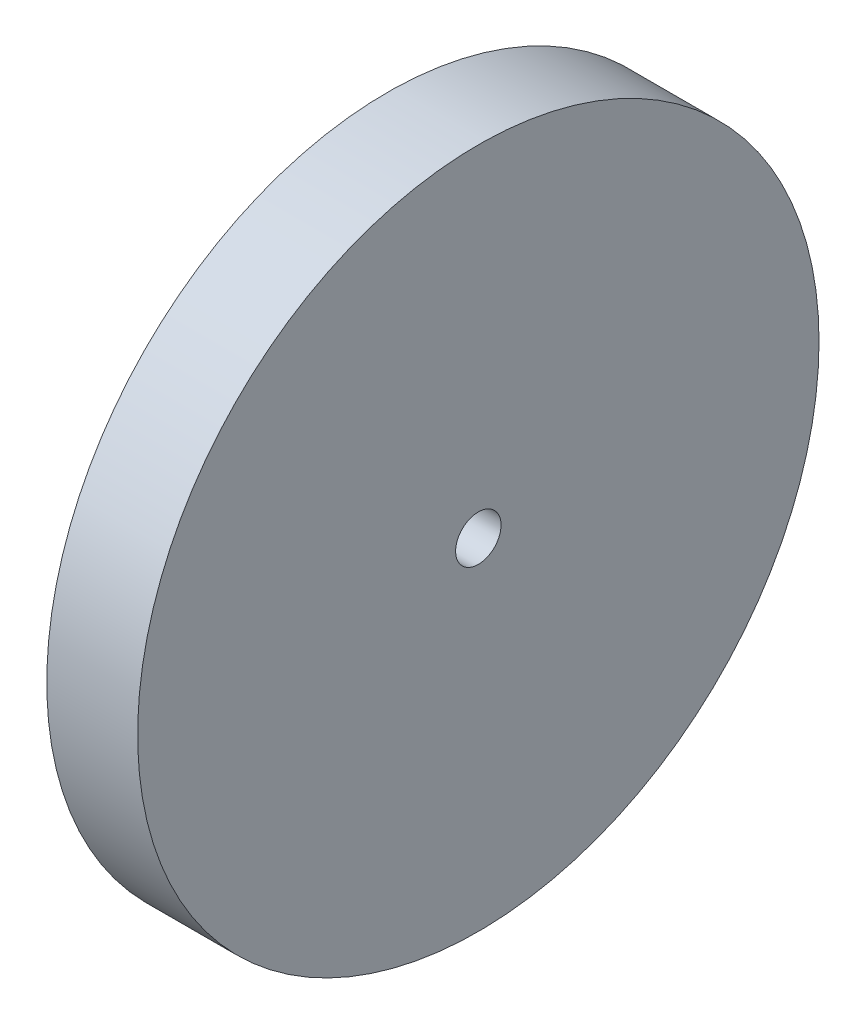
ISO-10303-21;
HEADER;
FILE_DESCRIPTION(('STEP AP214'),'2;1');
FILE_NAME('part.step','',(''),(''),'','','');
FILE_SCHEMA(('AUTOMOTIVE_DESIGN { 1 0 10303 214 1 1 1 1 }'));
ENDSEC;
DATA;
#1=APPLICATION_CONTEXT('core data for automotive mechanical design processes');
#2=APPLICATION_PROTOCOL_DEFINITION('international standard','automotive_design',2000,#1);
#3=PRODUCT_CONTEXT('',#1,'mechanical');
#4=PRODUCT('Part','Part','',(#3));
#5=PRODUCT_RELATED_PRODUCT_CATEGORY('part','',(#4));
#6=PRODUCT_DEFINITION_FORMATION('','',#4);
#7=PRODUCT_DEFINITION_CONTEXT('part definition',#1,'design');
#8=PRODUCT_DEFINITION('design','',#6,#7);
#9=PRODUCT_DEFINITION_SHAPE('','',#8);
#10=(LENGTH_UNIT() NAMED_UNIT(*) SI_UNIT(.MILLI.,.METRE.));
#11=(NAMED_UNIT(*) PLANE_ANGLE_UNIT() SI_UNIT($,.RADIAN.));
#12=(NAMED_UNIT(*) SI_UNIT($,.STERADIAN.) SOLID_ANGLE_UNIT());
#13=UNCERTAINTY_MEASURE_WITH_UNIT(LENGTH_MEASURE(1.E-05),#10,'distance_accuracy_value','');
#14=(GEOMETRIC_REPRESENTATION_CONTEXT(3) GLOBAL_UNCERTAINTY_ASSIGNED_CONTEXT((#13)) GLOBAL_UNIT_ASSIGNED_CONTEXT((#10,
#11,#12)) REPRESENTATION_CONTEXT('',''));
#15=CARTESIAN_POINT('',(0.,0.,0.));
#16=DIRECTION('',(0.,0.,1.));
#17=DIRECTION('',(1.,0.,0.));
#18=AXIS2_PLACEMENT_3D('',#15,#16,#17);
#19=CARTESIAN_POINT('',(0.,0.,0.));
#20=DIRECTION('',(1.,0.,0.));
#21=DIRECTION('',(0.,0.,-1.));
#22=AXIS2_PLACEMENT_3D('',#19,#20,#21);
#23=CYLINDRICAL_SURFACE('',#22,1.99999999999999);
#24=CARTESIAN_POINT('',(-13.45322017837,1.79843682124226,0.874999999999999));
#25=CARTESIAN_POINT('',(-13.4996455668491,1.79844267025872,0.874994185373086));
#26=CARTESIAN_POINT('',(-13.5461362263386,1.80026089575614,0.871281814553723));
#27=CARTESIAN_POINT('',(-13.6377609995906,1.80729814585877,0.856583265673776));
#28=CARTESIAN_POINT('',(-13.6828912938866,1.81252595391355,0.84557829993033));
#29=CARTESIAN_POINT('',(-13.7702976402033,1.8256650779135,0.816819377461344));
#30=CARTESIAN_POINT('',(-13.8125852056156,1.8335646755163,0.799094852047655));
#31=CARTESIAN_POINT('',(-13.8935757385446,1.85114060751144,0.757486974078159));
#32=CARTESIAN_POINT('',(-13.9322792980636,1.86081664768249,0.73360464113771));
#33=CARTESIAN_POINT('',(-14.0076858180357,1.88159814273405,0.67860444231314));
#34=CARTESIAN_POINT('',(-14.0441131990626,1.89275511820233,0.647128046535023));
#35=CARTESIAN_POINT('',(-14.1113783929879,1.91482009276172,0.578584404393027));
#36=CARTESIAN_POINT('',(-14.142213918134,1.92572798836067,0.54151488106822));
#37=CARTESIAN_POINT('',(-14.1988776130539,1.94670307260467,0.460623507148396));
#38=CARTESIAN_POINT('',(-14.2243889001395,1.95670347428988,0.41656077793032));
#39=CARTESIAN_POINT('',(-14.2675157518473,1.97409759337225,0.324251594935387));
#40=CARTESIAN_POINT('',(-14.2851351629206,1.98149258025648,0.276007192994719));
#41=CARTESIAN_POINT('',(-14.3109580815994,1.99247601660861,0.179604041111906));
#42=CARTESIAN_POINT('',(-14.319638658996,1.99625645567351,0.131595413599112));
#43=CARTESIAN_POINT('',(-14.3288859892659,2.00028676065695,0.0346643937267909));
#44=CARTESIAN_POINT('',(-14.3294563937463,2.00053821550072,-0.0142575774637081));
#45=CARTESIAN_POINT('',(-14.3227019762157,1.99759023252614,-0.108130873463996));
#46=CARTESIAN_POINT('',(-14.3159033487893,1.99462077737978,-0.153128695211823));
#47=CARTESIAN_POINT('',(-14.295515053418,1.98588800112158,-0.241269408956307));
#48=CARTESIAN_POINT('',(-14.2819248829422,1.98012447326713,-0.284412163433232));
#49=CARTESIAN_POINT('',(-14.2481883972403,1.96624268291741,-0.368417631333126));
#50=CARTESIAN_POINT('',(-14.2279450345039,1.95808977061224,-0.409235407844303));
#51=CARTESIAN_POINT('',(-14.1815782919894,1.94021222057016,-0.487002053634942));
#52=CARTESIAN_POINT('',(-14.1554527802275,1.93048701331643,-0.523949512986161));
#53=CARTESIAN_POINT('',(-14.095743534564,1.90954741359336,-0.595935871549107));
#54=CARTESIAN_POINT('',(-14.0617419102102,1.89827601276047,-0.630612038356138));
#55=CARTESIAN_POINT('',(-13.9884073903243,1.87605441136165,-0.693936886024361));
#56=CARTESIAN_POINT('',(-13.9490720130834,1.86510436321814,-0.722582745149668));
#57=CARTESIAN_POINT('',(-13.8642488780768,1.84433360774734,-0.774104007572307));
#58=CARTESIAN_POINT('',(-13.8185799874721,1.83457425910816,-0.796708133338992));
#59=CARTESIAN_POINT('',(-13.7235451295974,1.81804057215013,-0.833753424928245));
#60=CARTESIAN_POINT('',(-13.6741821543204,1.81126384804948,-0.848201117652945));
#61=CARTESIAN_POINT('',(-13.5768048279816,1.8020725724064,-0.86754954409033));
#62=CARTESIAN_POINT('',(-13.5289342267471,1.79938817756936,-0.873042695282303));
#63=CARTESIAN_POINT('',(-13.4328901766476,1.79791183626622,-0.876080687797387));
#64=CARTESIAN_POINT('',(-13.3847168599139,1.79911829529383,-0.873628785071821));
#65=CARTESIAN_POINT('',(-13.2931886211794,1.80500670942424,-0.861388170364229));
#66=CARTESIAN_POINT('',(-13.249740356961,1.80942578993547,-0.85215387305427));
#67=CARTESIAN_POINT('',(-13.1650554737938,1.82089297578771,-0.827365600067959));
#68=CARTESIAN_POINT('',(-13.1238194113395,1.82794173912936,-0.81181004259548));
#69=CARTESIAN_POINT('',(-13.0426847429497,1.84425139082008,-0.774064553531829));
#70=CARTESIAN_POINT('',(-13.0029259532811,1.85359632906455,-0.751611624558049));
#71=CARTESIAN_POINT('',(-12.9275374391374,1.87333686493426,-0.700961597965227));
#72=CARTESIAN_POINT('',(-12.8919096333482,1.88373294661273,-0.67276184779974));
#73=CARTESIAN_POINT('',(-12.8223972844785,1.9055511022817,-0.608384071274641));
#74=CARTESIAN_POINT('',(-12.7889703773977,1.91698003267099,-0.571712181701362));
#75=CARTESIAN_POINT('',(-12.7286480364516,1.93870750509733,-0.493028918701698));
#76=CARTESIAN_POINT('',(-12.7017534029818,1.94900590852694,-0.451016891911296));
#77=CARTESIAN_POINT('',(-12.6551778658299,1.96743104077039,-0.36232293883673));
#78=CARTESIAN_POINT('',(-12.6355478993033,1.97554233072842,-0.315610854101785));
#79=CARTESIAN_POINT('',(-12.6045830029,1.98855746644758,-0.219097297225345));
#80=CARTESIAN_POINT('',(-12.5932425737112,1.99346343839954,-0.169297897056046));
#81=CARTESIAN_POINT('',(-12.5799216972897,1.9992481211277,-0.07209118045084));
#82=CARTESIAN_POINT('',(-12.5772979505768,2.00040346809815,-0.0247879798759334));
#83=CARTESIAN_POINT('',(-12.5797156890887,1.99934575386789,0.0695781809476551));
#84=CARTESIAN_POINT('',(-12.5847555731484,1.99713339628286,0.116641189318635));
#85=CARTESIAN_POINT('',(-12.6018970800604,1.98974125718853,0.207139588656076));
#86=CARTESIAN_POINT('',(-12.6136929883777,1.98469010746016,0.250644310304771));
#87=CARTESIAN_POINT('',(-12.6436605807471,1.97220099963069,0.335028608079217));
#88=CARTESIAN_POINT('',(-12.66183340789,1.96476261362741,0.375907711996158));
#89=CARTESIAN_POINT('',(-12.7049588556092,1.94778329676525,0.455950413510898));
#90=CARTESIAN_POINT('',(-12.7301838494413,1.93816167830775,0.494949713940653));
#91=CARTESIAN_POINT('',(-12.7863173209961,1.9179284324557,0.568332496894421));
#92=CARTESIAN_POINT('',(-12.8172281396271,1.90731639818727,0.602714068131048));
#93=CARTESIAN_POINT('',(-12.8866180691496,1.8852720278619,0.668615771310957));
#94=CARTESIAN_POINT('',(-12.92549407957,1.87383871323809,0.699719139890721));
#95=CARTESIAN_POINT('',(-13.008235966694,1.85224037393765,0.755043607534097));
#96=CARTESIAN_POINT('',(-13.0521048360146,1.84207611764286,0.779260548271213));
#97=CARTESIAN_POINT('',(-13.1438407753336,1.82429849284974,0.820019671710732));
#98=CARTESIAN_POINT('',(-13.1917127591117,1.81668831862308,0.836552253811327));
#99=CARTESIAN_POINT('',(-13.2899205481475,1.80518424635639,0.861104681242927));
#100=CARTESIAN_POINT('',(-13.3402474868291,1.80127788482797,0.869153086488734));
#101=CARTESIAN_POINT('',(-13.4116225729651,1.79879556732175,0.874260805643789));
#102=CARTESIAN_POINT('',(-13.4324148213181,1.79843420002831,0.875002605802406));
#103=CARTESIAN_POINT('',(-13.45322017837,1.79843682124226,0.874999999999999));
#104=B_SPLINE_CURVE_WITH_KNOTS('',3,(#24,#25,#26,#27,#28,#29,#30,#31,#32,#33,#34,#35,#36,#37,
#38,#39,#40,#41,#42,#43,#44,#45,#46,#47,#48,#49,#50,#51,#52,#53,#54,#55,#56,#57,#58,#59,#60,#61,
#62,#63,#64,#65,#66,#67,#68,#69,#70,#71,#72,#73,#74,#75,#76,#77,#78,#79,#80,#81,#82,#83,#84,#85,
#86,#87,#88,#89,#90,#91,#92,#93,#94,#95,#96,#97,#98,#99,#100,#101,#102,#103),.UNSPECIFIED.,.T.,
.F.,(4,2,2,2,2,2,2,2,2,2,2,2,2,2,2,2,2,2,2,2,2,2,2,2,2,2,2,2,2,2,2,2,2,2,2,2,2,2,2,4),(0.,
0.139211854544829,0.278783757833573,0.417751277057172,0.556695800673241,0.704311269509711,
0.851986995525496,1.00685254156655,1.16164252475057,1.30765941027075,1.45361054957448,
1.58978716337857,1.72597385487562,1.86424242444373,2.00256119034027,2.1514705177321,
2.30044936949917,2.45528783220658,2.61000221454627,2.75399082716966,2.89792043948698,
3.03123544972419,3.16458384051276,3.30382998316913,3.44314054349794,3.5951953656407,
3.74726880958002,3.90038919363012,4.0534079045894,4.19484840308351,4.33625935442152,
4.47172667892147,4.60721829895103,4.74891487272681,4.8906699154392,5.04321071182055,
5.19584342435713,5.34866632230719,5.50097312018721,5.56336037066704),.UNSPECIFIED.);
#105=CARTESIAN_POINT('',(-13.45322017837,1.79843682124226,0.874999999999999));
#106=VERTEX_POINT('',#105);
#107=EDGE_CURVE('E64',#106,#106,#104,.T.);
#108=ORIENTED_EDGE('',*,*,#107,.F.);
#109=EDGE_LOOP('',(#108));
#110=FACE_BOUND('',#109,.T.);
#111=CARTESIAN_POINT('',(0.,0.,0.));
#112=DIRECTION('',(1.,0.,0.));
#113=DIRECTION('',(0.,0.,-1.));
#114=AXIS2_PLACEMENT_3D('',#111,#112,#113);
#115=CIRCLE('',#114,1.99999999999999);
#116=CARTESIAN_POINT('',(0.,0.,-1.99999999999999));
#117=VERTEX_POINT('',#116);
#118=EDGE_CURVE('E54',#117,#117,#115,.T.);
#119=ORIENTED_EDGE('',*,*,#118,.T.);
#120=EDGE_LOOP('',(#119));
#121=FACE_BOUND('',#120,.T.);
#122=CARTESIAN_POINT('',(-18.,0.,0.));
#123=DIRECTION('',(1.,0.,0.));
#124=DIRECTION('',(0.,0.,-1.));
#125=AXIS2_PLACEMENT_3D('',#122,#123,#124);
#126=CIRCLE('',#125,1.99999999999999);
#127=CARTESIAN_POINT('',(-18.,0.,-1.99999999999999));
#128=VERTEX_POINT('',#127);
#129=EDGE_CURVE('E10',#128,#128,#126,.T.);
#130=ORIENTED_EDGE('',*,*,#129,.F.);
#131=EDGE_LOOP('',(#130));
#132=FACE_BOUND('',#131,.T.);
#133=ADVANCED_FACE('F32',(#110,#121,#132),#23,.F.);
#134=CARTESIAN_POINT('',(-18.,5.,0.));
#135=DIRECTION('',(-1.,0.,0.));
#136=DIRECTION('',(0.,0.,1.));
#137=AXIS2_PLACEMENT_3D('',#134,#135,#136);
#138=PLANE('',#137);
#139=ORIENTED_EDGE('',*,*,#129,.T.);
#140=EDGE_LOOP('',(#139));
#141=FACE_BOUND('',#140,.T.);
#142=CARTESIAN_POINT('',(-18.,0.,0.));
#143=DIRECTION('',(1.,0.,0.));
#144=DIRECTION('',(0.,0.,-1.));
#145=AXIS2_PLACEMENT_3D('',#142,#143,#144);
#146=CIRCLE('',#145,5.);
#147=CARTESIAN_POINT('',(-18.,0.,-5.));
#148=VERTEX_POINT('',#147);
#149=EDGE_CURVE('E38',#148,#148,#146,.T.);
#150=ORIENTED_EDGE('',*,*,#149,.F.);
#151=EDGE_LOOP('',(#150));
#152=FACE_BOUND('',#151,.T.);
#153=ADVANCED_FACE('F91',(#141,#152),#138,.T.);
#154=CARTESIAN_POINT('',(0.,0.,0.));
#155=DIRECTION('',(1.,0.,0.));
#156=DIRECTION('',(0.,0.,-1.));
#157=AXIS2_PLACEMENT_3D('',#154,#155,#156);
#158=CYLINDRICAL_SURFACE('',#157,5.);
#159=CARTESIAN_POINT('',(-13.45322017837,4.9228421668788,0.874999999999999));
#160=CARTESIAN_POINT('',(-13.4044765120783,4.92284307499697,0.874998073539557));
#161=CARTESIAN_POINT('',(-13.3557071366336,4.92357397476884,0.870913147606656));
#162=CARTESIAN_POINT('',(-13.25953938974,4.92641556128211,0.854689981459766));
#163=CARTESIAN_POINT('',(-13.2121422829829,4.92852748100301,0.842544544648483));
#164=CARTESIAN_POINT('',(-13.1201246317655,4.93388475646331,0.810581240433705));
#165=CARTESIAN_POINT('',(-13.0755017036428,4.93712912285695,0.790770068454977));
#166=CARTESIAN_POINT('',(-12.990217100068,4.94438456334799,0.744054765254319));
#167=CARTESIAN_POINT('',(-12.9495550324841,4.94839556143087,0.717151337156948));
#168=CARTESIAN_POINT('',(-12.872900850826,4.95678097185183,0.656703779310403));
#169=CARTESIAN_POINT('',(-12.8369579756245,4.96115853789756,0.623097637866167));
#170=CARTESIAN_POINT('',(-12.7711906584155,4.96975589120863,0.550332633939766));
#171=CARTESIAN_POINT('',(-12.7413665937748,4.97397566872952,0.51117342923396));
#172=CARTESIAN_POINT('',(-12.6884971547799,4.98181553132084,0.428093104045913));
#173=CARTESIAN_POINT('',(-12.6654978435704,4.98543147235489,0.384142246104396));
#174=CARTESIAN_POINT('',(-12.627227119512,4.99162106697564,0.292926899802081));
#175=CARTESIAN_POINT('',(-12.6119551530828,4.99419479522293,0.245662649086159));
#176=CARTESIAN_POINT('',(-12.5897238897306,4.99798770637486,0.149671533158271));
#177=CARTESIAN_POINT('',(-12.5826817462932,4.9992203802933,0.100964396772047));
#178=CARTESIAN_POINT('',(-12.5768522109989,5.00023870350343,0.00304537017441892));
#179=CARTESIAN_POINT('',(-12.5780642031927,5.00002446076855,-0.0461664820998754));
#180=CARTESIAN_POINT('',(-12.5886443402899,4.99818371661764,-0.143130893939201));
#181=CARTESIAN_POINT('',(-12.5979233089294,4.99657265682183,-0.190893519071767));
#182=CARTESIAN_POINT('',(-12.6242333433602,4.99213654894816,-0.284173216176665));
#183=CARTESIAN_POINT('',(-12.6412646637993,4.9893114609923,-0.329690214330628));
#184=CARTESIAN_POINT('',(-12.6826831500164,4.98273861194286,-0.417449271832483));
#185=CARTESIAN_POINT('',(-12.7071066358228,4.9789863122702,-0.459673835906608));
#186=CARTESIAN_POINT('',(-12.7625894937887,4.9709751939494,-0.539458800879953));
#187=CARTESIAN_POINT('',(-12.793649456538,4.96671633023635,-0.577018786200772));
#188=CARTESIAN_POINT('',(-12.8620169805182,4.9580977872857,-0.646935876894303));
#189=CARTESIAN_POINT('',(-12.8994025162358,4.95373752143685,-0.679216709920823));
#190=CARTESIAN_POINT('',(-12.9790983816665,4.9454624226339,-0.737060264743535));
#191=CARTESIAN_POINT('',(-13.0214087663049,4.9415475946486,-0.762622911603708));
#192=CARTESIAN_POINT('',(-13.1098466262571,4.9346060965737,-0.806322044336454));
#193=CARTESIAN_POINT('',(-13.1559790999631,4.93158061381118,-0.824448615268406));
#194=CARTESIAN_POINT('',(-13.2506991598437,4.92677939981509,-0.852673278505629));
#195=CARTESIAN_POINT('',(-13.299286505656,4.92500354648059,-0.862772155207125));
#196=CARTESIAN_POINT('',(-13.3968525932563,4.92292649963477,-0.874545835364773));
#197=CARTESIAN_POINT('',(-13.4458177810996,4.92260621694777,-0.876329694679995));
#198=CARTESIAN_POINT('',(-13.5433467752425,4.92342563856456,-0.871713985213453));
#199=CARTESIAN_POINT('',(-13.5919105986211,4.92456528041931,-0.865314766467179));
#200=CARTESIAN_POINT('',(-13.6869072328927,4.92815844955311,-0.844607784274871));
#201=CARTESIAN_POINT('',(-13.7333526675969,4.93060264449508,-0.830356171120177));
#202=CARTESIAN_POINT('',(-13.8231961777391,4.93652160979565,-0.794408105046443));
#203=CARTESIAN_POINT('',(-13.866594054038,4.93999644742304,-0.772711166165632));
#204=CARTESIAN_POINT('',(-13.9495940049624,4.94762918558854,-0.722233434260734));
#205=CARTESIAN_POINT('',(-13.9891531962878,4.95179364615566,-0.693383138862326));
#206=CARTESIAN_POINT('',(-14.0629081337998,4.96031750209385,-0.629512391964065));
#207=CARTESIAN_POINT('',(-14.0971034620383,4.9646769126213,-0.594491460103899));
#208=CARTESIAN_POINT('',(-14.1595617733834,4.97316022831522,-0.518788866666416));
#209=CARTESIAN_POINT('',(-14.1877517875148,4.97728083740703,-0.478046575925644));
#210=CARTESIAN_POINT('',(-14.236886661375,4.98476842205262,-0.392341011884007));
#211=CARTESIAN_POINT('',(-14.2578317735038,4.98813542385933,-0.347377885699143));
#212=CARTESIAN_POINT('',(-14.2917703974613,4.99372215663664,-0.254717878442439));
#213=CARTESIAN_POINT('',(-14.3048011813031,4.99594725750524,-0.207034986784646));
#214=CARTESIAN_POINT('',(-14.3226608843745,4.99902226336019,-0.110115257508317));
#215=CARTESIAN_POINT('',(-14.3274905507923,4.99987229362628,-0.0608785618702644));
#216=CARTESIAN_POINT('',(-14.3287876723117,5.00009933383322,0.0370486139692459));
#217=CARTESIAN_POINT('',(-14.3253658303017,4.99949584443935,0.0857376177642916));
#218=CARTESIAN_POINT('',(-14.3104976775174,4.99692373636934,0.181835857215835));
#219=CARTESIAN_POINT('',(-14.2990514233488,4.99495512732298,0.229245101897529));
#220=CARTESIAN_POINT('',(-14.2685034917997,4.98987344263051,0.321389465944212));
#221=CARTESIAN_POINT('',(-14.2494121506771,4.98676191269648,0.3661281025404));
#222=CARTESIAN_POINT('',(-14.2041286462827,4.97973294623664,0.451784012491346));
#223=CARTESIAN_POINT('',(-14.1779360914348,4.97581546527185,0.492701074949028));
#224=CARTESIAN_POINT('',(-14.1188055841519,4.96754602270754,0.570107756976131));
#225=CARTESIAN_POINT('',(-14.0857869707684,4.96318921812377,0.606535249660261));
#226=CARTESIAN_POINT('',(-14.0141102726311,4.95456452663817,0.673371254635438));
#227=CARTESIAN_POINT('',(-13.9754508679116,4.95029666081621,0.703778354196428));
#228=CARTESIAN_POINT('',(-13.8932263349826,4.94229651148942,0.757933111841927));
#229=CARTESIAN_POINT('',(-13.8496248873744,4.93856872220172,0.781626301002854));
#230=CARTESIAN_POINT('',(-13.7590117440554,4.93212424297686,0.821314870424466));
#231=CARTESIAN_POINT('',(-13.7120034351501,4.92940656491337,0.837317778102986));
#232=CARTESIAN_POINT('',(-13.6295604452714,4.92587891597868,0.857781628925296));
#233=CARTESIAN_POINT('',(-13.5946189093884,4.92474663101162,0.864227890207769));
#234=CARTESIAN_POINT('',(-13.5241961783149,4.92322793379499,0.872837731365281));
#235=CARTESIAN_POINT('',(-13.4887149946826,4.92284150559315,0.875001402835787));
#236=CARTESIAN_POINT('',(-13.45322017837,4.9228421668788,0.874999999999999));
#237=B_SPLINE_CURVE_WITH_KNOTS('',3,(#159,#160,#161,#162,#163,#164,#165,#166,#167,#168,#169,
#170,#171,#172,#173,#174,#175,#176,#177,#178,#179,#180,#181,#182,#183,#184,#185,#186,#187,#188,
#189,#190,#191,#192,#193,#194,#195,#196,#197,#198,#199,#200,#201,#202,#203,#204,#205,#206,#207,
#208,#209,#210,#211,#212,#213,#214,#215,#216,#217,#218,#219,#220,#221,#222,#223,#224,#225,#226,
#227,#228,#229,#230,#231,#232,#233,#234,#235,#236),.UNSPECIFIED.,.T.,.F.,(4,2,2,2,2,2,2,2,2,2,2,
2,2,2,2,2,2,2,2,2,2,2,2,2,2,2,2,2,2,2,2,2,2,2,2,2,2,2,4),(0.,0.146101164953181,
0.292332947963994,0.438437296117103,0.584527164964141,0.732037167460386,0.879556264642579,
1.02804949490522,1.17653208573414,1.32350671966023,1.47047038600328,1.61582980987728,
1.76119400883468,1.90728435279678,2.05338770297162,2.20144435454404,2.34950265750048,
2.49775773829612,2.64599833111777,2.792289094643,2.93857360071282,3.08382539293052,
3.22908666764115,3.3758187701758,3.5225623002909,3.67099828718693,3.81942910230912,
3.96715535955237,4.11486815701679,4.26061027818323,4.40635137126931,4.55189608218353,
4.69744882037613,4.84483139209219,4.99224850734335,5.14082942553665,5.28926461170158,
5.39565679196015,5.50204669669217),.UNSPECIFIED.);
#238=CARTESIAN_POINT('',(-13.45322017837,4.9228421668788,0.874999999999999));
#239=VERTEX_POINT('',#238);
#240=EDGE_CURVE('E57',#239,#239,#237,.T.);
#241=ORIENTED_EDGE('',*,*,#240,.F.);
#242=EDGE_LOOP('',(#241));
#243=FACE_BOUND('',#242,.T.);
#244=ORIENTED_EDGE('',*,*,#149,.T.);
#245=EDGE_LOOP('',(#244));
#246=FACE_BOUND('',#245,.T.);
#247=CARTESIAN_POINT('',(-8.,0.,0.));
#248=DIRECTION('',(1.,0.,0.));
#249=DIRECTION('',(0.,0.,-1.));
#250=AXIS2_PLACEMENT_3D('',#247,#248,#249);
#251=CIRCLE('',#250,5.);
#252=CARTESIAN_POINT('',(-8.,0.,-5.));
#253=VERTEX_POINT('',#252);
#254=EDGE_CURVE('E42',#253,#253,#251,.T.);
#255=ORIENTED_EDGE('',*,*,#254,.F.);
#256=EDGE_LOOP('',(#255));
#257=FACE_BOUND('',#256,.T.);
#258=ADVANCED_FACE('F68',(#243,#246,#257),#158,.T.);
#259=CARTESIAN_POINT('',(-8.,30.,0.));
#260=DIRECTION('',(-1.,0.,0.));
#261=DIRECTION('',(0.,0.,1.));
#262=AXIS2_PLACEMENT_3D('',#259,#260,#261);
#263=PLANE('',#262);
#264=ORIENTED_EDGE('',*,*,#254,.T.);
#265=EDGE_LOOP('',(#264));
#266=FACE_BOUND('',#265,.T.);
#267=CARTESIAN_POINT('',(-8.00000000000001,0.,0.));
#268=DIRECTION('',(1.,0.,0.));
#269=DIRECTION('',(0.,0.,-1.));
#270=AXIS2_PLACEMENT_3D('',#267,#268,#269);
#271=CIRCLE('',#270,30.);
#272=CARTESIAN_POINT('',(-8.00000000000001,0.,-30.));
#273=VERTEX_POINT('',#272);
#274=EDGE_CURVE('E46',#273,#273,#271,.T.);
#275=ORIENTED_EDGE('',*,*,#274,.F.);
#276=EDGE_LOOP('',(#275));
#277=FACE_BOUND('',#276,.T.);
#278=ADVANCED_FACE('F84',(#266,#277),#263,.T.);
#279=CARTESIAN_POINT('',(0.,0.,0.));
#280=DIRECTION('',(1.,0.,0.));
#281=DIRECTION('',(0.,0.,-1.));
#282=AXIS2_PLACEMENT_3D('',#279,#280,#281);
#283=CYLINDRICAL_SURFACE('',#282,30.);
#284=ORIENTED_EDGE('',*,*,#274,.T.);
#285=EDGE_LOOP('',(#284));
#286=FACE_BOUND('',#285,.T.);
#287=CARTESIAN_POINT('',(0.,0.,0.));
#288=DIRECTION('',(1.,0.,0.));
#289=DIRECTION('',(0.,0.,-1.));
#290=AXIS2_PLACEMENT_3D('',#287,#288,#289);
#291=CIRCLE('',#290,30.);
#292=CARTESIAN_POINT('',(0.,0.,-30.));
#293=VERTEX_POINT('',#292);
#294=EDGE_CURVE('E51',#293,#293,#291,.T.);
#295=ORIENTED_EDGE('',*,*,#294,.F.);
#296=EDGE_LOOP('',(#295));
#297=FACE_BOUND('',#296,.T.);
#298=ADVANCED_FACE('F81',(#286,#297),#283,.T.);
#299=CARTESIAN_POINT('',(0.,30.,0.));
#300=DIRECTION('',(1.,0.,0.));
#301=DIRECTION('',(0.,0.,-1.));
#302=AXIS2_PLACEMENT_3D('',#299,#300,#301);
#303=PLANE('',#302);
#304=ORIENTED_EDGE('',*,*,#294,.T.);
#305=EDGE_LOOP('',(#304));
#306=FACE_BOUND('',#305,.T.);
#307=ORIENTED_EDGE('',*,*,#118,.F.);
#308=EDGE_LOOP('',(#307));
#309=FACE_BOUND('',#308,.T.);
#310=ADVANCED_FACE('F74',(#306,#309),#303,.T.);
#311=CARTESIAN_POINT('',(-13.45322017837,5.,0.));
#312=DIRECTION('',(0.,1.,0.));
#313=DIRECTION('',(0.,0.,1.));
#314=AXIS2_PLACEMENT_3D('',#311,#312,#313);
#315=CYLINDRICAL_SURFACE('',#314,0.874999999999999);
#316=ORIENTED_EDGE('',*,*,#240,.T.);
#317=EDGE_LOOP('',(#316));
#318=FACE_BOUND('',#317,.T.);
#319=ORIENTED_EDGE('',*,*,#107,.T.);
#320=EDGE_LOOP('',(#319));
#321=FACE_BOUND('',#320,.T.);
#322=ADVANCED_FACE('F71',(#318,#321),#315,.F.);
#323=CLOSED_SHELL('',(#133,#153,#258,#278,#298,#310,#322));
#324=MANIFOLD_SOLID_BREP('B2',#323);
#325=ADVANCED_BREP_SHAPE_REPRESENTATION('',(#18,#324),#14);
#326=SHAPE_DEFINITION_REPRESENTATION(#9,#325);
ENDSEC;
END-ISO-10303-21;
